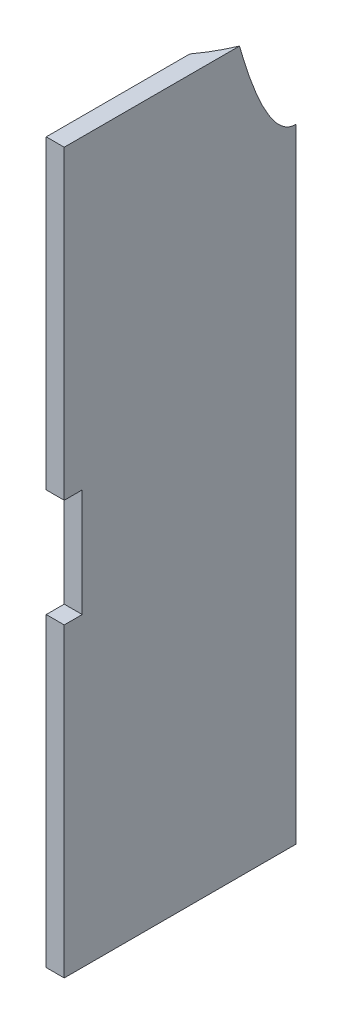
ISO-10303-21;
HEADER;
FILE_DESCRIPTION(('STEP AP214'),'2;1');
FILE_NAME('part.step','',(''),(''),'','','');
FILE_SCHEMA(('AUTOMOTIVE_DESIGN { 1 0 10303 214 1 1 1 1 }'));
ENDSEC;
DATA;
#1=APPLICATION_CONTEXT('core data for automotive mechanical design processes');
#2=APPLICATION_PROTOCOL_DEFINITION('international standard','automotive_design',2000,#1);
#3=PRODUCT_CONTEXT('',#1,'mechanical');
#4=PRODUCT('Part','Part','',(#3));
#5=PRODUCT_RELATED_PRODUCT_CATEGORY('part','',(#4));
#6=PRODUCT_DEFINITION_FORMATION('','',#4);
#7=PRODUCT_DEFINITION_CONTEXT('part definition',#1,'design');
#8=PRODUCT_DEFINITION('design','',#6,#7);
#9=PRODUCT_DEFINITION_SHAPE('','',#8);
#10=(LENGTH_UNIT() NAMED_UNIT(*) SI_UNIT(.MILLI.,.METRE.));
#11=(NAMED_UNIT(*) PLANE_ANGLE_UNIT() SI_UNIT($,.RADIAN.));
#12=(NAMED_UNIT(*) SI_UNIT($,.STERADIAN.) SOLID_ANGLE_UNIT());
#13=UNCERTAINTY_MEASURE_WITH_UNIT(LENGTH_MEASURE(1.E-05),#10,'distance_accuracy_value','');
#14=(GEOMETRIC_REPRESENTATION_CONTEXT(3) GLOBAL_UNCERTAINTY_ASSIGNED_CONTEXT((#13)) GLOBAL_UNIT_ASSIGNED_CONTEXT((#10,
#11,#12)) REPRESENTATION_CONTEXT('',''));
#15=CARTESIAN_POINT('',(0.,0.,0.));
#16=DIRECTION('',(0.,0.,1.));
#17=DIRECTION('',(1.,0.,0.));
#18=AXIS2_PLACEMENT_3D('',#15,#16,#17);
#19=CARTESIAN_POINT('',(0.,31.75,-7.73683999999999));
#20=DIRECTION('',(0.,0.,1.));
#21=DIRECTION('',(0.,-1.,0.));
#22=AXIS2_PLACEMENT_3D('',#19,#20,#21);
#23=PLANE('',#22);
#24=DIRECTION('',(0.115500858174567,0.993307380301253,0.));
#25=VECTOR('',#24,1.);
#26=CARTESIAN_POINT('',(-19.7533485375233,-160.260866719542,-7.73684000000001));
#27=LINE('',#26,#25);
#28=CARTESIAN_POINT('',(1.58749999999997,23.2704307031537,-7.73684));
#29=VERTEX_POINT('',#28);
#30=CARTESIAN_POINT('',(0.,9.61793070315456,-7.73684000000001));
#31=VERTEX_POINT('',#30);
#32=EDGE_CURVE('E12',#29,#31,#27,.F.);
#33=ORIENTED_EDGE('',*,*,#32,.F.);
#34=DIRECTION('',(0.,-1.,0.));
#35=VECTOR('',#34,1.);
#36=CARTESIAN_POINT('',(1.5875,31.75,-7.73683999999999));
#37=LINE('',#36,#35);
#38=CARTESIAN_POINT('',(1.5875,-31.75,-7.73684));
#39=VERTEX_POINT('',#38);
#40=EDGE_CURVE('E210',#29,#39,#37,.T.);
#41=ORIENTED_EDGE('',*,*,#40,.T.);
#42=DIRECTION('',(1.,0.,0.));
#43=VECTOR('',#42,1.);
#44=CARTESIAN_POINT('',(0.,-31.75,-7.73684));
#45=LINE('',#44,#43);
#46=CARTESIAN_POINT('',(0.,-31.75,-7.73684));
#47=VERTEX_POINT('',#46);
#48=EDGE_CURVE('E223',#47,#39,#45,.T.);
#49=ORIENTED_EDGE('',*,*,#48,.F.);
#50=DIRECTION('',(0.,-1.,0.));
#51=VECTOR('',#50,1.);
#52=CARTESIAN_POINT('',(0.,31.75,-7.73683999999999));
#53=LINE('',#52,#51);
#54=EDGE_CURVE('E138',#31,#47,#53,.T.);
#55=ORIENTED_EDGE('',*,*,#54,.F.);
#56=EDGE_LOOP('',(#33,#41,#49,#55));
#57=FACE_BOUND('',#56,.T.);
#58=ADVANCED_FACE('F134',(#57),#23,.F.);
#59=CARTESIAN_POINT('',(1.5875,-31.75,12.7));
#60=DIRECTION('',(0.,0.,-1.));
#61=DIRECTION('',(-1.,0.,0.));
#62=AXIS2_PLACEMENT_3D('',#59,#60,#61);
#63=PLANE('',#62);
#64=DIRECTION('',(1.,0.,0.));
#65=VECTOR('',#64,1.);
#66=CARTESIAN_POINT('',(-1.5875,4.7625,12.7));
#67=LINE('',#66,#65);
#68=CARTESIAN_POINT('',(0.,4.7625,12.7));
#69=VERTEX_POINT('',#68);
#70=CARTESIAN_POINT('',(1.5875,4.7625,12.7));
#71=VERTEX_POINT('',#70);
#72=EDGE_CURVE('E216',#69,#71,#67,.T.);
#73=ORIENTED_EDGE('',*,*,#72,.T.);
#74=DIRECTION('',(0.,-1.,0.));
#75=VECTOR('',#74,1.);
#76=CARTESIAN_POINT('',(1.5875,-31.75,12.7));
#77=LINE('',#76,#75);
#78=CARTESIAN_POINT('',(1.5875,31.75,12.7));
#79=VERTEX_POINT('',#78);
#80=EDGE_CURVE('E260',#79,#71,#77,.T.);
#81=ORIENTED_EDGE('',*,*,#80,.F.);
#82=DIRECTION('',(-1.,0.,0.));
#83=VECTOR('',#82,1.);
#84=CARTESIAN_POINT('',(1.5875,31.75,12.7));
#85=LINE('',#84,#83);
#86=CARTESIAN_POINT('',(0.,31.75,12.7));
#87=VERTEX_POINT('',#86);
#88=EDGE_CURVE('E219',#79,#87,#85,.T.);
#89=ORIENTED_EDGE('',*,*,#88,.T.);
#90=DIRECTION('',(0.,-1.,0.));
#91=VECTOR('',#90,1.);
#92=CARTESIAN_POINT('',(0.,-31.75,12.7));
#93=LINE('',#92,#91);
#94=EDGE_CURVE('E236',#87,#69,#93,.T.);
#95=ORIENTED_EDGE('',*,*,#94,.T.);
#96=EDGE_LOOP('',(#73,#81,#89,#95));
#97=FACE_BOUND('',#96,.T.);
#98=ADVANCED_FACE('F280',(#97),#63,.F.);
#99=CARTESIAN_POINT('',(1.5875,0.,0.));
#100=DIRECTION('',(-1.,0.,0.));
#101=DIRECTION('',(0.,0.,1.));
#102=AXIS2_PLACEMENT_3D('',#99,#100,#101);
#103=PLANE('',#102);
#104=CARTESIAN_POINT('',(1.5875,136.524999999995,-7.7380288533353));
#105=DIRECTION('',(-1.,0.,0.));
#106=DIRECTION('',(0.,1.,0.));
#107=AXIS2_PLACEMENT_3D('',#104,#105,#106);
#108=ELLIPSE('',#107,113.254569764577,13.081);
#109=CARTESIAN_POINT('',(1.5875,31.75,-2.7717646654911));
#110=VERTEX_POINT('',#109);
#111=EDGE_CURVE('E144',#110,#29,#108,.F.);
#112=ORIENTED_EDGE('',*,*,#111,.F.);
#113=DIRECTION('',(0.,0.,1.));
#114=VECTOR('',#113,1.);
#115=CARTESIAN_POINT('',(1.5875,31.75,12.7));
#116=LINE('',#115,#114);
#117=EDGE_CURVE('E257',#110,#79,#116,.T.);
#118=ORIENTED_EDGE('',*,*,#117,.T.);
#119=ORIENTED_EDGE('',*,*,#80,.T.);
#120=DIRECTION('',(0.,0.,-1.));
#121=VECTOR('',#120,1.);
#122=CARTESIAN_POINT('',(1.5875,4.7625,12.7));
#123=LINE('',#122,#121);
#124=CARTESIAN_POINT('',(1.5875,4.7625,11.1125));
#125=VERTEX_POINT('',#124);
#126=EDGE_CURVE('E263',#71,#125,#123,.T.);
#127=ORIENTED_EDGE('',*,*,#126,.T.);
#128=DIRECTION('',(0.,-1.,0.));
#129=VECTOR('',#128,1.);
#130=CARTESIAN_POINT('',(1.5875,4.7625,11.1125));
#131=LINE('',#130,#129);
#132=CARTESIAN_POINT('',(1.5875,-4.7625,11.1125));
#133=VERTEX_POINT('',#132);
#134=EDGE_CURVE('E270',#125,#133,#131,.T.);
#135=ORIENTED_EDGE('',*,*,#134,.T.);
#136=DIRECTION('',(0.,0.,-1.));
#137=VECTOR('',#136,1.);
#138=CARTESIAN_POINT('',(1.5875,-4.7625,12.7));
#139=LINE('',#138,#137);
#140=CARTESIAN_POINT('',(1.5875,-4.7625,12.7));
#141=VERTEX_POINT('',#140);
#142=EDGE_CURVE('E225',#141,#133,#139,.T.);
#143=ORIENTED_EDGE('',*,*,#142,.F.);
#144=CARTESIAN_POINT('',(1.5875,-31.75,12.7));
#145=VERTEX_POINT('',#144);
#146=EDGE_CURVE('E259',#141,#145,#77,.T.);
#147=ORIENTED_EDGE('',*,*,#146,.T.);
#148=DIRECTION('',(0.,0.,-1.));
#149=VECTOR('',#148,1.);
#150=CARTESIAN_POINT('',(1.5875,-31.75,12.7));
#151=LINE('',#150,#149);
#152=EDGE_CURVE('E215',#145,#39,#151,.T.);
#153=ORIENTED_EDGE('',*,*,#152,.T.);
#154=ORIENTED_EDGE('',*,*,#40,.F.);
#155=EDGE_LOOP('',(#112,#118,#119,#127,#135,#143,#147,#153,#154));
#156=FACE_BOUND('',#155,.T.);
#157=ADVANCED_FACE('F213',(#156),#103,.F.);
#158=CARTESIAN_POINT('',(0.,0.,0.));
#159=DIRECTION('',(-1.,0.,0.));
#160=DIRECTION('',(0.,0.,1.));
#161=AXIS2_PLACEMENT_3D('',#158,#159,#160);
#162=PLANE('',#161);
#163=DIRECTION('',(0.,0.,1.));
#164=VECTOR('',#163,1.);
#165=CARTESIAN_POINT('',(0.,31.75,12.7));
#166=LINE('',#165,#164);
#167=CARTESIAN_POINT('',(0.,31.75,0.0300264791627328));
#168=VERTEX_POINT('',#167);
#169=EDGE_CURVE('E227',#168,#87,#166,.T.);
#170=ORIENTED_EDGE('',*,*,#169,.F.);
#171=CARTESIAN_POINT('',(0.,122.872499999996,-7.7380288533353));
#172=DIRECTION('',(-1.,0.,0.));
#173=DIRECTION('',(0.,1.,0.));
#174=AXIS2_PLACEMENT_3D('',#171,#172,#173);
#175=ELLIPSE('',#174,113.254569764577,13.081);
#176=EDGE_CURVE('E150',#168,#31,#175,.F.);
#177=ORIENTED_EDGE('',*,*,#176,.T.);
#178=ORIENTED_EDGE('',*,*,#54,.T.);
#179=DIRECTION('',(0.,0.,-1.));
#180=VECTOR('',#179,1.);
#181=CARTESIAN_POINT('',(0.,-31.75,12.7));
#182=LINE('',#181,#180);
#183=CARTESIAN_POINT('',(0.,-31.75,12.7));
#184=VERTEX_POINT('',#183);
#185=EDGE_CURVE('E234',#184,#47,#182,.T.);
#186=ORIENTED_EDGE('',*,*,#185,.F.);
#187=CARTESIAN_POINT('',(0.,-4.7625,12.7));
#188=VERTEX_POINT('',#187);
#189=EDGE_CURVE('E228',#188,#184,#93,.T.);
#190=ORIENTED_EDGE('',*,*,#189,.F.);
#191=DIRECTION('',(0.,0.,1.));
#192=VECTOR('',#191,1.);
#193=CARTESIAN_POINT('',(0.,-4.76249999999999,0.));
#194=LINE('',#193,#192);
#195=CARTESIAN_POINT('',(0.,-4.7625,11.1125));
#196=VERTEX_POINT('',#195);
#197=EDGE_CURVE('E246',#196,#188,#194,.T.);
#198=ORIENTED_EDGE('',*,*,#197,.F.);
#199=DIRECTION('',(0.,1.,0.));
#200=VECTOR('',#199,1.);
#201=CARTESIAN_POINT('',(0.,0.,11.1125));
#202=LINE('',#201,#200);
#203=CARTESIAN_POINT('',(0.,4.7625,11.1125));
#204=VERTEX_POINT('',#203);
#205=EDGE_CURVE('E238',#196,#204,#202,.T.);
#206=ORIENTED_EDGE('',*,*,#205,.T.);
#207=DIRECTION('',(0.,0.,1.));
#208=VECTOR('',#207,1.);
#209=CARTESIAN_POINT('',(0.,4.7625,0.));
#210=LINE('',#209,#208);
#211=EDGE_CURVE('E229',#204,#69,#210,.T.);
#212=ORIENTED_EDGE('',*,*,#211,.T.);
#213=ORIENTED_EDGE('',*,*,#94,.F.);
#214=EDGE_LOOP('',(#170,#177,#178,#186,#190,#198,#206,#212,#213));
#215=FACE_BOUND('',#214,.T.);
#216=ADVANCED_FACE('F136',(#215),#162,.T.);
#217=CARTESIAN_POINT('',(1.5875,31.75,12.7));
#218=DIRECTION('',(0.,-1.,0.));
#219=DIRECTION('',(0.,0.,-1.));
#220=AXIS2_PLACEMENT_3D('',#217,#218,#219);
#221=PLANE('',#220);
#222=CARTESIAN_POINT('',(-10.5956395348835,31.75,-7.7380288533353));
#223=DIRECTION('',(0.,-1.,0.));
#224=DIRECTION('',(1.,0.,0.));
#225=AXIS2_PLACEMENT_3D('',#222,#223,#224);
#226=ELLIPSE('',#225,13.1691360191372,13.081);
#227=EDGE_CURVE('E202',#168,#110,#226,.F.);
#228=ORIENTED_EDGE('',*,*,#227,.F.);
#229=ORIENTED_EDGE('',*,*,#169,.T.);
#230=ORIENTED_EDGE('',*,*,#88,.F.);
#231=ORIENTED_EDGE('',*,*,#117,.F.);
#232=EDGE_LOOP('',(#228,#229,#230,#231));
#233=FACE_BOUND('',#232,.T.);
#234=ADVANCED_FACE('F311',(#233),#221,.F.);
#235=ORIENTED_EDGE('',*,*,#146,.F.);
#236=DIRECTION('',(1.,0.,0.));
#237=VECTOR('',#236,1.);
#238=CARTESIAN_POINT('',(-1.5875,-4.7625,12.7));
#239=LINE('',#238,#237);
#240=EDGE_CURVE('E248',#188,#141,#239,.T.);
#241=ORIENTED_EDGE('',*,*,#240,.F.);
#242=ORIENTED_EDGE('',*,*,#189,.T.);
#243=DIRECTION('',(-1.,0.,0.));
#244=VECTOR('',#243,1.);
#245=CARTESIAN_POINT('',(1.5875,-31.75,12.7));
#246=LINE('',#245,#244);
#247=EDGE_CURVE('E251',#145,#184,#246,.T.);
#248=ORIENTED_EDGE('',*,*,#247,.F.);
#249=EDGE_LOOP('',(#235,#241,#242,#248));
#250=FACE_BOUND('',#249,.T.);
#251=ADVANCED_FACE('F288',(#250),#63,.F.);
#252=CARTESIAN_POINT('',(1.5875,-31.75,12.7));
#253=DIRECTION('',(0.,1.,0.));
#254=DIRECTION('',(0.,0.,1.));
#255=AXIS2_PLACEMENT_3D('',#252,#253,#254);
#256=PLANE('',#255);
#257=ORIENTED_EDGE('',*,*,#185,.T.);
#258=ORIENTED_EDGE('',*,*,#48,.T.);
#259=ORIENTED_EDGE('',*,*,#152,.F.);
#260=ORIENTED_EDGE('',*,*,#247,.T.);
#261=EDGE_LOOP('',(#257,#258,#259,#260));
#262=FACE_BOUND('',#261,.T.);
#263=ADVANCED_FACE('F284',(#262),#256,.F.);
#264=CARTESIAN_POINT('',(-1.5875,4.7625,12.7));
#265=DIRECTION('',(0.,-1.,0.));
#266=DIRECTION('',(0.,0.,-1.));
#267=AXIS2_PLACEMENT_3D('',#264,#265,#266);
#268=PLANE('',#267);
#269=DIRECTION('',(1.,0.,0.));
#270=VECTOR('',#269,1.);
#271=CARTESIAN_POINT('',(-1.5875,4.7625,11.1125));
#272=LINE('',#271,#270);
#273=EDGE_CURVE('E254',#204,#125,#272,.T.);
#274=ORIENTED_EDGE('',*,*,#273,.T.);
#275=ORIENTED_EDGE('',*,*,#126,.F.);
#276=ORIENTED_EDGE('',*,*,#72,.F.);
#277=ORIENTED_EDGE('',*,*,#211,.F.);
#278=EDGE_LOOP('',(#274,#275,#276,#277));
#279=FACE_BOUND('',#278,.T.);
#280=ADVANCED_FACE('F277',(#279),#268,.T.);
#281=CARTESIAN_POINT('',(-1.5875,4.7625,11.1125));
#282=DIRECTION('',(0.,0.,1.));
#283=DIRECTION('',(1.,0.,0.));
#284=AXIS2_PLACEMENT_3D('',#281,#282,#283);
#285=PLANE('',#284);
#286=DIRECTION('',(1.,0.,0.));
#287=VECTOR('',#286,1.);
#288=CARTESIAN_POINT('',(-1.5875,-4.7625,11.1125));
#289=LINE('',#288,#287);
#290=EDGE_CURVE('E249',#196,#133,#289,.T.);
#291=ORIENTED_EDGE('',*,*,#290,.T.);
#292=ORIENTED_EDGE('',*,*,#134,.F.);
#293=ORIENTED_EDGE('',*,*,#273,.F.);
#294=ORIENTED_EDGE('',*,*,#205,.F.);
#295=EDGE_LOOP('',(#291,#292,#293,#294));
#296=FACE_BOUND('',#295,.T.);
#297=ADVANCED_FACE('F295',(#296),#285,.T.);
#298=CARTESIAN_POINT('',(-1.5875,-4.7625,12.7));
#299=DIRECTION('',(0.,-1.,0.));
#300=DIRECTION('',(0.,0.,-1.));
#301=AXIS2_PLACEMENT_3D('',#298,#299,#300);
#302=PLANE('',#301);
#303=ORIENTED_EDGE('',*,*,#197,.T.);
#304=ORIENTED_EDGE('',*,*,#240,.T.);
#305=ORIENTED_EDGE('',*,*,#142,.T.);
#306=ORIENTED_EDGE('',*,*,#290,.F.);
#307=EDGE_LOOP('',(#303,#304,#305,#306));
#308=FACE_BOUND('',#307,.T.);
#309=ADVANCED_FACE('F293',(#308),#302,.F.);
#310=CARTESIAN_POINT('',(-32.7468023255817,-158.75,-7.7380288533353));
#311=DIRECTION('',(0.115500858174567,0.993307380301253,0.));
#312=DIRECTION('',(0.993307380301253,-0.115500858174567,0.));
#313=AXIS2_PLACEMENT_3D('',#310,#311,#312);
#314=CYLINDRICAL_SURFACE('',#313,13.081);
#315=ORIENTED_EDGE('',*,*,#227,.T.);
#316=ORIENTED_EDGE('',*,*,#111,.T.);
#317=ORIENTED_EDGE('',*,*,#32,.T.);
#318=ORIENTED_EDGE('',*,*,#176,.F.);
#319=EDGE_LOOP('',(#315,#316,#317,#318));
#320=FACE_BOUND('',#319,.T.);
#321=ADVANCED_FACE('F201',(#320),#314,.F.);
#322=CLOSED_SHELL('',(#58,#98,#157,#216,#234,#251,#263,#280,#297,#309,#321));
#323=MANIFOLD_SOLID_BREP('B2',#322);
#324=ADVANCED_BREP_SHAPE_REPRESENTATION('',(#18,#323),#14);
#325=SHAPE_DEFINITION_REPRESENTATION(#9,#324);
ENDSEC;
END-ISO-10303-21;
